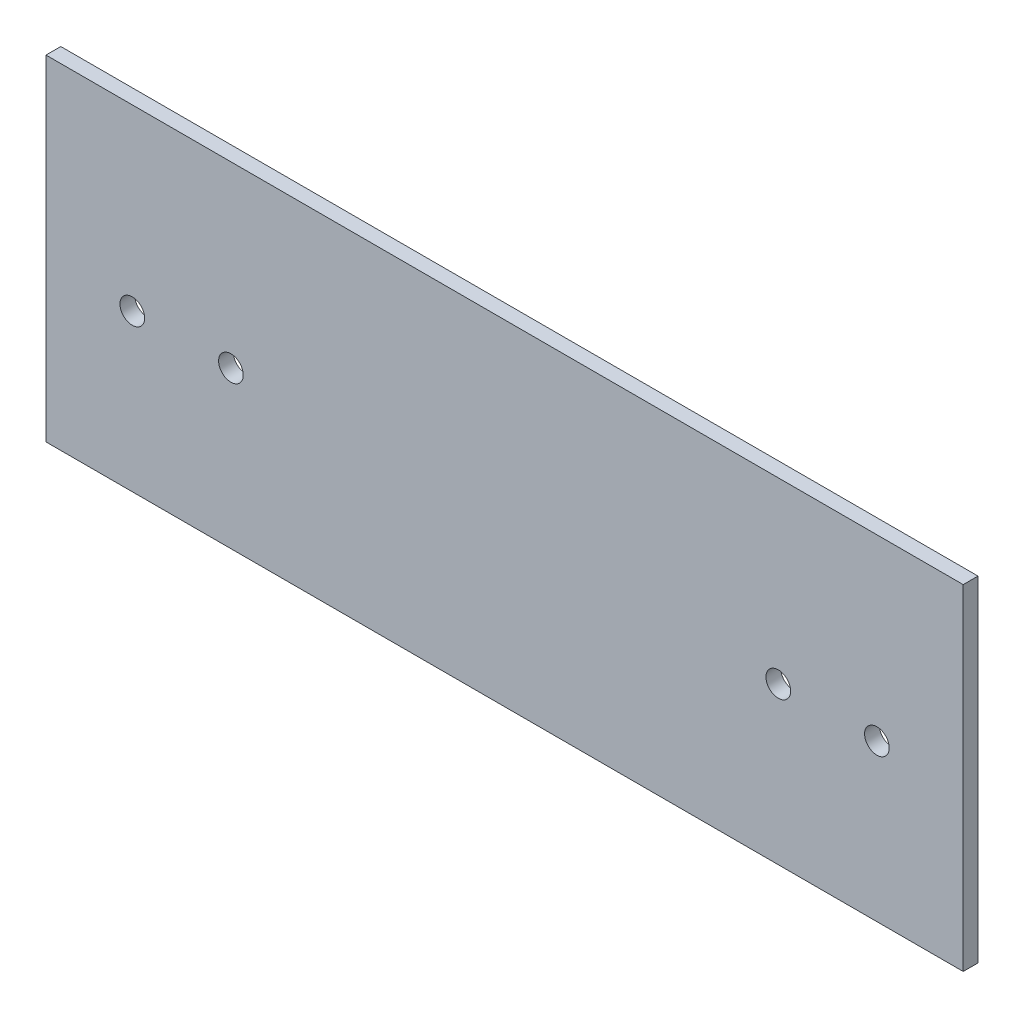
ISO-10303-21;
HEADER;
FILE_DESCRIPTION(('STEP AP214'),'2;1');
FILE_NAME('part.step','',(''),(''),'','','');
FILE_SCHEMA(('AUTOMOTIVE_DESIGN { 1 0 10303 214 1 1 1 1 }'));
ENDSEC;
DATA;
#1=APPLICATION_CONTEXT('core data for automotive mechanical design processes');
#2=APPLICATION_PROTOCOL_DEFINITION('international standard','automotive_design',2000,#1);
#3=PRODUCT_CONTEXT('',#1,'mechanical');
#4=PRODUCT('Part','Part','',(#3));
#5=PRODUCT_RELATED_PRODUCT_CATEGORY('part','',(#4));
#6=PRODUCT_DEFINITION_FORMATION('','',#4);
#7=PRODUCT_DEFINITION_CONTEXT('part definition',#1,'design');
#8=PRODUCT_DEFINITION('design','',#6,#7);
#9=PRODUCT_DEFINITION_SHAPE('','',#8);
#10=(LENGTH_UNIT() NAMED_UNIT(*) SI_UNIT(.MILLI.,.METRE.));
#11=(NAMED_UNIT(*) PLANE_ANGLE_UNIT() SI_UNIT($,.RADIAN.));
#12=(NAMED_UNIT(*) SI_UNIT($,.STERADIAN.) SOLID_ANGLE_UNIT());
#13=UNCERTAINTY_MEASURE_WITH_UNIT(LENGTH_MEASURE(1.E-05),#10,'distance_accuracy_value','');
#14=(GEOMETRIC_REPRESENTATION_CONTEXT(3) GLOBAL_UNCERTAINTY_ASSIGNED_CONTEXT((#13)) GLOBAL_UNIT_ASSIGNED_CONTEXT((#10,
#11,#12)) REPRESENTATION_CONTEXT('',''));
#15=CARTESIAN_POINT('',(0.,0.,0.));
#16=DIRECTION('',(0.,0.,1.));
#17=DIRECTION('',(1.,0.,0.));
#18=AXIS2_PLACEMENT_3D('',#15,#16,#17);
#19=CARTESIAN_POINT('',(0.,0.,3.));
#20=DIRECTION('',(0.,0.,-1.));
#21=DIRECTION('',(-1.,0.,0.));
#22=AXIS2_PLACEMENT_3D('',#19,#20,#21);
#23=PLANE('',#22);
#24=DIRECTION('',(0.,-1.,0.));
#25=VECTOR('',#24,1.);
#26=CARTESIAN_POINT('',(-183.,52.0515047983515,3.));
#27=LINE('',#26,#25);
#28=CARTESIAN_POINT('',(-183.,120.,3.));
#29=VERTEX_POINT('',#28);
#30=CARTESIAN_POINT('',(-183.,52.0515047983515,3.));
#31=VERTEX_POINT('',#30);
#32=EDGE_CURVE('E89',#29,#31,#27,.T.);
#33=ORIENTED_EDGE('',*,*,#32,.T.);
#34=DIRECTION('',(1.,0.,0.));
#35=VECTOR('',#34,1.);
#36=CARTESIAN_POINT('',(-183.,52.0515047983515,3.));
#37=LINE('',#36,#35);
#38=CARTESIAN_POINT('',(3.,52.0515047983515,3.));
#39=VERTEX_POINT('',#38);
#40=EDGE_CURVE('E84',#31,#39,#37,.T.);
#41=ORIENTED_EDGE('',*,*,#40,.T.);
#42=DIRECTION('',(0.,1.,0.));
#43=VECTOR('',#42,1.);
#44=CARTESIAN_POINT('',(3.,52.0515047983515,3.));
#45=LINE('',#44,#43);
#46=CARTESIAN_POINT('',(3.,120.,3.));
#47=VERTEX_POINT('',#46);
#48=EDGE_CURVE('E87',#39,#47,#45,.T.);
#49=ORIENTED_EDGE('',*,*,#48,.T.);
#50=DIRECTION('',(-1.,0.,0.));
#51=VECTOR('',#50,1.);
#52=CARTESIAN_POINT('',(-183.,120.,3.));
#53=LINE('',#52,#51);
#54=EDGE_CURVE('E54',#47,#29,#53,.T.);
#55=ORIENTED_EDGE('',*,*,#54,.T.);
#56=EDGE_LOOP('',(#33,#41,#49,#55));
#57=FACE_BOUND('',#56,.T.);
#58=CARTESIAN_POINT('',(-165.5,83.79,3.));
#59=DIRECTION('',(0.,0.,1.));
#60=DIRECTION('',(1.,0.,0.));
#61=AXIS2_PLACEMENT_3D('',#58,#59,#60);
#62=CIRCLE('',#61,2.49999999999997);
#63=CARTESIAN_POINT('',(-163.,83.79,3.));
#64=VERTEX_POINT('',#63);
#65=EDGE_CURVE('E104',#64,#64,#62,.T.);
#66=ORIENTED_EDGE('',*,*,#65,.F.);
#67=EDGE_LOOP('',(#66));
#68=FACE_BOUND('',#67,.T.);
#69=CARTESIAN_POINT('',(-145.5,83.79,3.));
#70=DIRECTION('',(0.,0.,1.));
#71=DIRECTION('',(1.,0.,0.));
#72=AXIS2_PLACEMENT_3D('',#69,#70,#71);
#73=CIRCLE('',#72,2.5);
#74=CARTESIAN_POINT('',(-143.,83.79,3.));
#75=VERTEX_POINT('',#74);
#76=EDGE_CURVE('E119',#75,#75,#73,.T.);
#77=ORIENTED_EDGE('',*,*,#76,.F.);
#78=EDGE_LOOP('',(#77));
#79=FACE_BOUND('',#78,.T.);
#80=CARTESIAN_POINT('',(-34.5,83.79,3.));
#81=DIRECTION('',(0.,0.,1.));
#82=DIRECTION('',(1.,0.,0.));
#83=AXIS2_PLACEMENT_3D('',#80,#81,#82);
#84=CIRCLE('',#83,2.5);
#85=CARTESIAN_POINT('',(-32.,83.79,3.));
#86=VERTEX_POINT('',#85);
#87=EDGE_CURVE('E125',#86,#86,#84,.T.);
#88=ORIENTED_EDGE('',*,*,#87,.F.);
#89=EDGE_LOOP('',(#88));
#90=FACE_BOUND('',#89,.T.);
#91=CARTESIAN_POINT('',(-14.5,83.79,3.));
#92=DIRECTION('',(0.,0.,1.));
#93=DIRECTION('',(1.,0.,0.));
#94=AXIS2_PLACEMENT_3D('',#91,#92,#93);
#95=CIRCLE('',#94,2.5);
#96=CARTESIAN_POINT('',(-12.,83.79,3.));
#97=VERTEX_POINT('',#96);
#98=EDGE_CURVE('E131',#97,#97,#95,.T.);
#99=ORIENTED_EDGE('',*,*,#98,.F.);
#100=EDGE_LOOP('',(#99));
#101=FACE_BOUND('',#100,.T.);
#102=ADVANCED_FACE('F37',(#57,#68,#79,#90,#101),#23,.F.);
#103=CARTESIAN_POINT('',(0.,0.,0.));
#104=DIRECTION('',(0.,0.,-1.));
#105=DIRECTION('',(-1.,0.,0.));
#106=AXIS2_PLACEMENT_3D('',#103,#104,#105);
#107=PLANE('',#106);
#108=CARTESIAN_POINT('',(-34.5,83.79,0.));
#109=DIRECTION('',(0.,0.,1.));
#110=DIRECTION('',(1.,0.,0.));
#111=AXIS2_PLACEMENT_3D('',#108,#109,#110);
#112=CIRCLE('',#111,2.5);
#113=CARTESIAN_POINT('',(-32.,83.79,0.));
#114=VERTEX_POINT('',#113);
#115=EDGE_CURVE('E128',#114,#114,#112,.T.);
#116=ORIENTED_EDGE('',*,*,#115,.T.);
#117=EDGE_LOOP('',(#116));
#118=FACE_BOUND('',#117,.T.);
#119=CARTESIAN_POINT('',(-165.5,83.79,0.));
#120=DIRECTION('',(0.,0.,1.));
#121=DIRECTION('',(1.,0.,0.));
#122=AXIS2_PLACEMENT_3D('',#119,#120,#121);
#123=CIRCLE('',#122,2.49999999999997);
#124=CARTESIAN_POINT('',(-163.,83.79,0.));
#125=VERTEX_POINT('',#124);
#126=EDGE_CURVE('E116',#125,#125,#123,.T.);
#127=ORIENTED_EDGE('',*,*,#126,.T.);
#128=EDGE_LOOP('',(#127));
#129=FACE_BOUND('',#128,.T.);
#130=DIRECTION('',(0.,-1.,0.));
#131=VECTOR('',#130,1.);
#132=CARTESIAN_POINT('',(-183.,52.0515047983515,0.));
#133=LINE('',#132,#131);
#134=CARTESIAN_POINT('',(-183.,120.,0.));
#135=VERTEX_POINT('',#134);
#136=CARTESIAN_POINT('',(-183.,52.0515047983515,0.));
#137=VERTEX_POINT('',#136);
#138=EDGE_CURVE('E101',#135,#137,#133,.T.);
#139=ORIENTED_EDGE('',*,*,#138,.F.);
#140=DIRECTION('',(-1.,0.,0.));
#141=VECTOR('',#140,1.);
#142=CARTESIAN_POINT('',(-183.,120.,0.));
#143=LINE('',#142,#141);
#144=CARTESIAN_POINT('',(3.,120.,0.));
#145=VERTEX_POINT('',#144);
#146=EDGE_CURVE('E77',#145,#135,#143,.T.);
#147=ORIENTED_EDGE('',*,*,#146,.F.);
#148=DIRECTION('',(0.,1.,0.));
#149=VECTOR('',#148,1.);
#150=CARTESIAN_POINT('',(3.,52.0515047983515,0.));
#151=LINE('',#150,#149);
#152=CARTESIAN_POINT('',(3.,52.0515047983515,0.));
#153=VERTEX_POINT('',#152);
#154=EDGE_CURVE('E71',#153,#145,#151,.T.);
#155=ORIENTED_EDGE('',*,*,#154,.F.);
#156=DIRECTION('',(1.,0.,0.));
#157=VECTOR('',#156,1.);
#158=CARTESIAN_POINT('',(-60.,52.0515047983515,0.));
#159=LINE('',#158,#157);
#160=EDGE_CURVE('E93',#137,#153,#159,.T.);
#161=ORIENTED_EDGE('',*,*,#160,.F.);
#162=EDGE_LOOP('',(#139,#147,#155,#161));
#163=FACE_BOUND('',#162,.T.);
#164=CARTESIAN_POINT('',(-145.5,83.79,0.));
#165=DIRECTION('',(0.,0.,1.));
#166=DIRECTION('',(1.,0.,0.));
#167=AXIS2_PLACEMENT_3D('',#164,#165,#166);
#168=CIRCLE('',#167,2.5);
#169=CARTESIAN_POINT('',(-143.,83.79,0.));
#170=VERTEX_POINT('',#169);
#171=EDGE_CURVE('E122',#170,#170,#168,.T.);
#172=ORIENTED_EDGE('',*,*,#171,.T.);
#173=EDGE_LOOP('',(#172));
#174=FACE_BOUND('',#173,.T.);
#175=CARTESIAN_POINT('',(-14.5,83.79,0.));
#176=DIRECTION('',(0.,0.,1.));
#177=DIRECTION('',(1.,0.,0.));
#178=AXIS2_PLACEMENT_3D('',#175,#176,#177);
#179=CIRCLE('',#178,2.5);
#180=CARTESIAN_POINT('',(-12.,83.79,0.));
#181=VERTEX_POINT('',#180);
#182=EDGE_CURVE('E134',#181,#181,#179,.T.);
#183=ORIENTED_EDGE('',*,*,#182,.T.);
#184=EDGE_LOOP('',(#183));
#185=FACE_BOUND('',#184,.T.);
#186=ADVANCED_FACE('F112',(#118,#129,#163,#174,#185),#107,.T.);
#187=CARTESIAN_POINT('',(-183.,52.0515047983515,3.));
#188=DIRECTION('',(1.,0.,0.));
#189=DIRECTION('',(0.,0.,-1.));
#190=AXIS2_PLACEMENT_3D('',#187,#188,#189);
#191=PLANE('',#190);
#192=ORIENTED_EDGE('',*,*,#138,.T.);
#193=DIRECTION('',(0.,0.,-1.));
#194=VECTOR('',#193,1.);
#195=CARTESIAN_POINT('',(-183.,52.0515047983515,3.));
#196=LINE('',#195,#194);
#197=EDGE_CURVE('E11',#31,#137,#196,.T.);
#198=ORIENTED_EDGE('',*,*,#197,.F.);
#199=ORIENTED_EDGE('',*,*,#32,.F.);
#200=DIRECTION('',(0.,0.,-1.));
#201=VECTOR('',#200,1.);
#202=CARTESIAN_POINT('',(-183.,120.,3.));
#203=LINE('',#202,#201);
#204=EDGE_CURVE('E97',#29,#135,#203,.T.);
#205=ORIENTED_EDGE('',*,*,#204,.T.);
#206=EDGE_LOOP('',(#192,#198,#199,#205));
#207=FACE_BOUND('',#206,.T.);
#208=ADVANCED_FACE('F39',(#207),#191,.F.);
#209=CARTESIAN_POINT('',(-60.,52.0515047983515,3.));
#210=DIRECTION('',(0.,1.,0.));
#211=DIRECTION('',(0.,0.,1.));
#212=AXIS2_PLACEMENT_3D('',#209,#210,#211);
#213=PLANE('',#212);
#214=ORIENTED_EDGE('',*,*,#160,.T.);
#215=DIRECTION('',(0.,0.,-1.));
#216=VECTOR('',#215,1.);
#217=CARTESIAN_POINT('',(3.,52.0515047983515,3.));
#218=LINE('',#217,#216);
#219=EDGE_CURVE('E46',#39,#153,#218,.T.);
#220=ORIENTED_EDGE('',*,*,#219,.F.);
#221=ORIENTED_EDGE('',*,*,#40,.F.);
#222=ORIENTED_EDGE('',*,*,#197,.T.);
#223=EDGE_LOOP('',(#214,#220,#221,#222));
#224=FACE_BOUND('',#223,.T.);
#225=ADVANCED_FACE('F92',(#224),#213,.F.);
#226=CARTESIAN_POINT('',(3.,52.0515047983515,3.));
#227=DIRECTION('',(-1.,0.,0.));
#228=DIRECTION('',(0.,0.,1.));
#229=AXIS2_PLACEMENT_3D('',#226,#227,#228);
#230=PLANE('',#229);
#231=ORIENTED_EDGE('',*,*,#154,.T.);
#232=DIRECTION('',(0.,0.,-1.));
#233=VECTOR('',#232,1.);
#234=CARTESIAN_POINT('',(3.,120.,3.));
#235=LINE('',#234,#233);
#236=EDGE_CURVE('E94',#47,#145,#235,.T.);
#237=ORIENTED_EDGE('',*,*,#236,.F.);
#238=ORIENTED_EDGE('',*,*,#48,.F.);
#239=ORIENTED_EDGE('',*,*,#219,.T.);
#240=EDGE_LOOP('',(#231,#237,#238,#239));
#241=FACE_BOUND('',#240,.T.);
#242=ADVANCED_FACE('F95',(#241),#230,.F.);
#243=CARTESIAN_POINT('',(-183.,120.,3.));
#244=DIRECTION('',(0.,-1.,0.));
#245=DIRECTION('',(0.,0.,-1.));
#246=AXIS2_PLACEMENT_3D('',#243,#244,#245);
#247=PLANE('',#246);
#248=ORIENTED_EDGE('',*,*,#146,.T.);
#249=ORIENTED_EDGE('',*,*,#204,.F.);
#250=ORIENTED_EDGE('',*,*,#54,.F.);
#251=ORIENTED_EDGE('',*,*,#236,.T.);
#252=EDGE_LOOP('',(#248,#249,#250,#251));
#253=FACE_BOUND('',#252,.T.);
#254=ADVANCED_FACE('F109',(#253),#247,.F.);
#255=CARTESIAN_POINT('',(-165.5,83.79,3.));
#256=DIRECTION('',(0.,0.,-1.));
#257=DIRECTION('',(-1.,0.,0.));
#258=AXIS2_PLACEMENT_3D('',#255,#256,#257);
#259=CYLINDRICAL_SURFACE('',#258,2.49999999999997);
#260=ORIENTED_EDGE('',*,*,#65,.T.);
#261=EDGE_LOOP('',(#260));
#262=FACE_BOUND('',#261,.T.);
#263=ORIENTED_EDGE('',*,*,#126,.F.);
#264=EDGE_LOOP('',(#263));
#265=FACE_BOUND('',#264,.T.);
#266=ADVANCED_FACE('F151',(#262,#265),#259,.F.);
#267=CARTESIAN_POINT('',(-145.5,83.79,3.));
#268=DIRECTION('',(0.,0.,-1.));
#269=DIRECTION('',(-1.,0.,0.));
#270=AXIS2_PLACEMENT_3D('',#267,#268,#269);
#271=CYLINDRICAL_SURFACE('',#270,2.5);
#272=ORIENTED_EDGE('',*,*,#76,.T.);
#273=EDGE_LOOP('',(#272));
#274=FACE_BOUND('',#273,.T.);
#275=ORIENTED_EDGE('',*,*,#171,.F.);
#276=EDGE_LOOP('',(#275));
#277=FACE_BOUND('',#276,.T.);
#278=ADVANCED_FACE('F207',(#274,#277),#271,.F.);
#279=CARTESIAN_POINT('',(-34.5,83.79,3.));
#280=DIRECTION('',(0.,0.,-1.));
#281=DIRECTION('',(-1.,0.,0.));
#282=AXIS2_PLACEMENT_3D('',#279,#280,#281);
#283=CYLINDRICAL_SURFACE('',#282,2.5);
#284=ORIENTED_EDGE('',*,*,#87,.T.);
#285=EDGE_LOOP('',(#284));
#286=FACE_BOUND('',#285,.T.);
#287=ORIENTED_EDGE('',*,*,#115,.F.);
#288=EDGE_LOOP('',(#287));
#289=FACE_BOUND('',#288,.T.);
#290=ADVANCED_FACE('F216',(#286,#289),#283,.F.);
#291=CARTESIAN_POINT('',(-14.5,83.79,3.));
#292=DIRECTION('',(0.,0.,-1.));
#293=DIRECTION('',(-1.,0.,0.));
#294=AXIS2_PLACEMENT_3D('',#291,#292,#293);
#295=CYLINDRICAL_SURFACE('',#294,2.5);
#296=ORIENTED_EDGE('',*,*,#98,.T.);
#297=EDGE_LOOP('',(#296));
#298=FACE_BOUND('',#297,.T.);
#299=ORIENTED_EDGE('',*,*,#182,.F.);
#300=EDGE_LOOP('',(#299));
#301=FACE_BOUND('',#300,.T.);
#302=ADVANCED_FACE('F140',(#298,#301),#295,.F.);
#303=CLOSED_SHELL('',(#102,#186,#208,#225,#242,#254,#266,#278,#290,#302));
#304=MANIFOLD_SOLID_BREP('B2',#303);
#305=ADVANCED_BREP_SHAPE_REPRESENTATION('',(#18,#304),#14);
#306=SHAPE_DEFINITION_REPRESENTATION(#9,#305);
ENDSEC;
END-ISO-10303-21;
